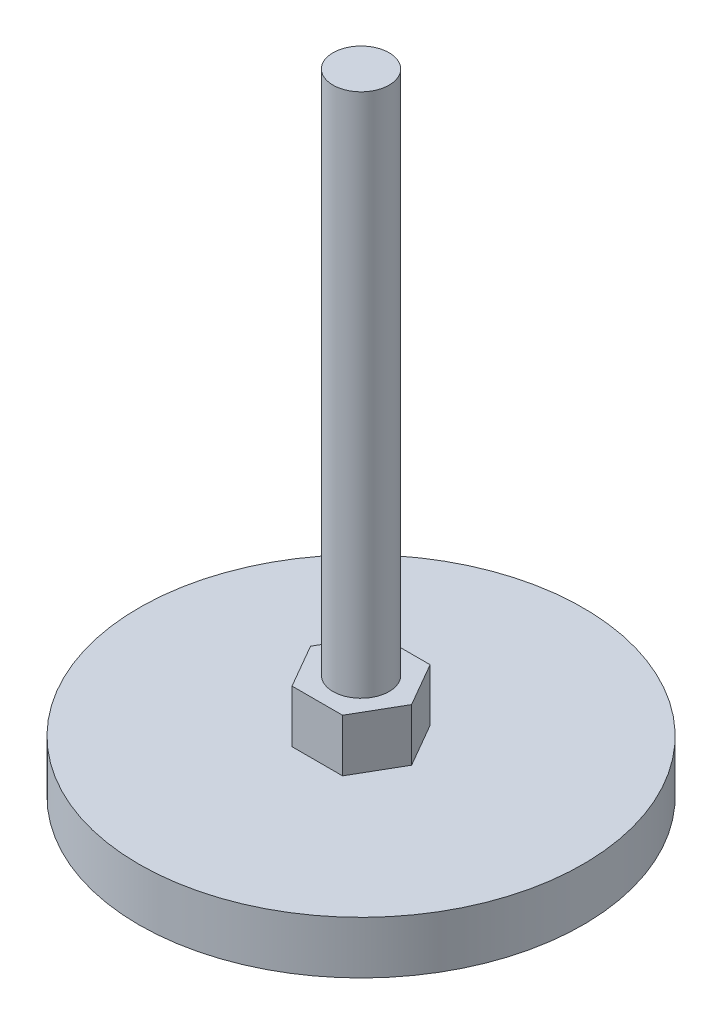
ISO-10303-21;
HEADER;
FILE_DESCRIPTION(('STEP AP214'),'2;1');
FILE_NAME('part.step','',(''),(''),'','','');
FILE_SCHEMA(('AUTOMOTIVE_DESIGN { 1 0 10303 214 1 1 1 1 }'));
ENDSEC;
DATA;
#1=APPLICATION_CONTEXT('core data for automotive mechanical design processes');
#2=APPLICATION_PROTOCOL_DEFINITION('international standard','automotive_design',2000,#1);
#3=PRODUCT_CONTEXT('',#1,'mechanical');
#4=PRODUCT('Part','Part','',(#3));
#5=PRODUCT_RELATED_PRODUCT_CATEGORY('part','',(#4));
#6=PRODUCT_DEFINITION_FORMATION('','',#4);
#7=PRODUCT_DEFINITION_CONTEXT('part definition',#1,'design');
#8=PRODUCT_DEFINITION('design','',#6,#7);
#9=PRODUCT_DEFINITION_SHAPE('','',#8);
#10=(LENGTH_UNIT() NAMED_UNIT(*) SI_UNIT(.MILLI.,.METRE.));
#11=(NAMED_UNIT(*) PLANE_ANGLE_UNIT() SI_UNIT($,.RADIAN.));
#12=(NAMED_UNIT(*) SI_UNIT($,.STERADIAN.) SOLID_ANGLE_UNIT());
#13=UNCERTAINTY_MEASURE_WITH_UNIT(LENGTH_MEASURE(1.E-05),#10,'distance_accuracy_value','');
#14=(GEOMETRIC_REPRESENTATION_CONTEXT(3) GLOBAL_UNCERTAINTY_ASSIGNED_CONTEXT((#13)) GLOBAL_UNIT_ASSIGNED_CONTEXT((#10,
#11,#12)) REPRESENTATION_CONTEXT('',''));
#15=CARTESIAN_POINT('',(0.,0.,0.));
#16=DIRECTION('',(0.,0.,1.));
#17=DIRECTION('',(1.,0.,0.));
#18=AXIS2_PLACEMENT_3D('',#15,#16,#17);
#19=CARTESIAN_POINT('',(0.,12.,0.));
#20=DIRECTION('',(0.,1.,0.));
#21=DIRECTION('',(0.,0.,1.));
#22=AXIS2_PLACEMENT_3D('',#19,#20,#21);
#23=PLANE('',#22);
#24=CARTESIAN_POINT('',(0.,12.,0.));
#25=DIRECTION('',(0.,1.,0.));
#26=DIRECTION('',(0.,0.,1.));
#27=AXIS2_PLACEMENT_3D('',#24,#25,#26);
#28=CIRCLE('',#27,50.744242673168);
#29=CARTESIAN_POINT('',(0.,12.,50.744242673168));
#30=VERTEX_POINT('',#29);
#31=EDGE_CURVE('E11',#30,#30,#28,.T.);
#32=ORIENTED_EDGE('',*,*,#31,.T.);
#33=EDGE_LOOP('',(#32));
#34=FACE_BOUND('',#33,.T.);
#35=DIRECTION('',(-0.5,0.,-0.866025403784438));
#36=VECTOR('',#35,1.);
#37=CARTESIAN_POINT('',(11.5470053837925,12.,0.));
#38=LINE('',#37,#36);
#39=CARTESIAN_POINT('',(11.5470053837925,12.,0.));
#40=VERTEX_POINT('',#39);
#41=CARTESIAN_POINT('',(5.77350269189625,12.,-10.));
#42=VERTEX_POINT('',#41);
#43=EDGE_CURVE('E120',#40,#42,#38,.T.);
#44=ORIENTED_EDGE('',*,*,#43,.F.);
#45=DIRECTION('',(0.5,0.,-0.866025403784439));
#46=VECTOR('',#45,1.);
#47=CARTESIAN_POINT('',(5.77350269189626,12.,10.));
#48=LINE('',#47,#46);
#49=CARTESIAN_POINT('',(5.77350269189626,12.,10.));
#50=VERTEX_POINT('',#49);
#51=EDGE_CURVE('E117',#50,#40,#48,.T.);
#52=ORIENTED_EDGE('',*,*,#51,.F.);
#53=DIRECTION('',(1.,0.,0.));
#54=VECTOR('',#53,1.);
#55=CARTESIAN_POINT('',(-5.77350269189627,12.,10.));
#56=LINE('',#55,#54);
#57=CARTESIAN_POINT('',(-5.77350269189627,12.,10.));
#58=VERTEX_POINT('',#57);
#59=EDGE_CURVE('E76',#58,#50,#56,.T.);
#60=ORIENTED_EDGE('',*,*,#59,.F.);
#61=DIRECTION('',(0.5,0.,0.866025403784439));
#62=VECTOR('',#61,1.);
#63=CARTESIAN_POINT('',(-11.5470053837925,12.,0.));
#64=LINE('',#63,#62);
#65=CARTESIAN_POINT('',(-11.5470053837925,12.,0.));
#66=VERTEX_POINT('',#65);
#67=EDGE_CURVE('E126',#66,#58,#64,.T.);
#68=ORIENTED_EDGE('',*,*,#67,.F.);
#69=DIRECTION('',(-0.5,0.,0.866025403784439));
#70=VECTOR('',#69,1.);
#71=CARTESIAN_POINT('',(-5.77350269189627,12.,-10.));
#72=LINE('',#71,#70);
#73=CARTESIAN_POINT('',(-5.77350269189627,12.,-10.));
#74=VERTEX_POINT('',#73);
#75=EDGE_CURVE('E106',#74,#66,#72,.T.);
#76=ORIENTED_EDGE('',*,*,#75,.F.);
#77=DIRECTION('',(-1.,0.,0.));
#78=VECTOR('',#77,1.);
#79=CARTESIAN_POINT('',(5.77350269189625,12.,-10.));
#80=LINE('',#79,#78);
#81=EDGE_CURVE('E123',#42,#74,#80,.T.);
#82=ORIENTED_EDGE('',*,*,#81,.F.);
#83=EDGE_LOOP('',(#44,#52,#60,#68,#76,#82));
#84=FACE_BOUND('',#83,.T.);
#85=ADVANCED_FACE('F33',(#34,#84),#23,.T.);
#86=CARTESIAN_POINT('',(0.,12.,0.));
#87=DIRECTION('',(0.,-1.,0.));
#88=DIRECTION('',(0.,0.,-1.));
#89=AXIS2_PLACEMENT_3D('',#86,#87,#88);
#90=CYLINDRICAL_SURFACE('',#89,50.744242673168);
#91=ORIENTED_EDGE('',*,*,#31,.F.);
#92=EDGE_LOOP('',(#91));
#93=FACE_BOUND('',#92,.T.);
#94=CARTESIAN_POINT('',(0.,0.,0.));
#95=DIRECTION('',(0.,1.,0.));
#96=DIRECTION('',(0.,0.,1.));
#97=AXIS2_PLACEMENT_3D('',#94,#95,#96);
#98=CIRCLE('',#97,50.744242673168);
#99=CARTESIAN_POINT('',(0.,0.,50.744242673168));
#100=VERTEX_POINT('',#99);
#101=EDGE_CURVE('E37',#100,#100,#98,.T.);
#102=ORIENTED_EDGE('',*,*,#101,.T.);
#103=EDGE_LOOP('',(#102));
#104=FACE_BOUND('',#103,.T.);
#105=ADVANCED_FACE('F35',(#93,#104),#90,.T.);
#106=CARTESIAN_POINT('',(0.,0.,0.));
#107=DIRECTION('',(0.,1.,0.));
#108=DIRECTION('',(0.,0.,1.));
#109=AXIS2_PLACEMENT_3D('',#106,#107,#108);
#110=PLANE('',#109);
#111=ORIENTED_EDGE('',*,*,#101,.F.);
#112=EDGE_LOOP('',(#111));
#113=FACE_BOUND('',#112,.T.);
#114=ADVANCED_FACE('F142',(#113),#110,.F.);
#115=CARTESIAN_POINT('',(5.77350269189626,24.,10.));
#116=DIRECTION('',(-0.866025403784439,0.,-0.5));
#117=DIRECTION('',(-0.5,0.,0.866025403784439));
#118=AXIS2_PLACEMENT_3D('',#115,#116,#117);
#119=PLANE('',#118);
#120=ORIENTED_EDGE('',*,*,#51,.T.);
#121=DIRECTION('',(0.,-1.,0.));
#122=VECTOR('',#121,1.);
#123=CARTESIAN_POINT('',(11.5470053837925,24.,0.));
#124=LINE('',#123,#122);
#125=CARTESIAN_POINT('',(11.5470053837925,24.,0.));
#126=VERTEX_POINT('',#125);
#127=EDGE_CURVE('E136',#126,#40,#124,.T.);
#128=ORIENTED_EDGE('',*,*,#127,.F.);
#129=DIRECTION('',(0.5,0.,-0.866025403784439));
#130=VECTOR('',#129,1.);
#131=CARTESIAN_POINT('',(5.77350269189626,24.,10.));
#132=LINE('',#131,#130);
#133=CARTESIAN_POINT('',(5.77350269189626,24.,10.));
#134=VERTEX_POINT('',#133);
#135=EDGE_CURVE('E129',#134,#126,#132,.T.);
#136=ORIENTED_EDGE('',*,*,#135,.F.);
#137=DIRECTION('',(0.,-1.,0.));
#138=VECTOR('',#137,1.);
#139=CARTESIAN_POINT('',(5.77350269189626,24.,10.));
#140=LINE('',#139,#138);
#141=EDGE_CURVE('E113',#134,#50,#140,.T.);
#142=ORIENTED_EDGE('',*,*,#141,.T.);
#143=EDGE_LOOP('',(#120,#128,#136,#142));
#144=FACE_BOUND('',#143,.T.);
#145=ADVANCED_FACE('F144',(#144),#119,.F.);
#146=CARTESIAN_POINT('',(11.5470053837925,24.,0.));
#147=DIRECTION('',(-0.866025403784439,0.,0.5));
#148=DIRECTION('',(0.5,0.,0.866025403784439));
#149=AXIS2_PLACEMENT_3D('',#146,#147,#148);
#150=PLANE('',#149);
#151=ORIENTED_EDGE('',*,*,#43,.T.);
#152=DIRECTION('',(0.,-1.,0.));
#153=VECTOR('',#152,1.);
#154=CARTESIAN_POINT('',(5.77350269189625,24.,-10.));
#155=LINE('',#154,#153);
#156=CARTESIAN_POINT('',(5.77350269189625,24.,-10.));
#157=VERTEX_POINT('',#156);
#158=EDGE_CURVE('E133',#157,#42,#155,.T.);
#159=ORIENTED_EDGE('',*,*,#158,.F.);
#160=DIRECTION('',(-0.5,0.,-0.866025403784438));
#161=VECTOR('',#160,1.);
#162=CARTESIAN_POINT('',(11.5470053837925,24.,0.));
#163=LINE('',#162,#161);
#164=EDGE_CURVE('E84',#126,#157,#163,.T.);
#165=ORIENTED_EDGE('',*,*,#164,.F.);
#166=ORIENTED_EDGE('',*,*,#127,.T.);
#167=EDGE_LOOP('',(#151,#159,#165,#166));
#168=FACE_BOUND('',#167,.T.);
#169=ADVANCED_FACE('F149',(#168),#150,.F.);
#170=CARTESIAN_POINT('',(5.77350269189625,24.,-10.));
#171=DIRECTION('',(0.,0.,1.));
#172=DIRECTION('',(1.,0.,0.));
#173=AXIS2_PLACEMENT_3D('',#170,#171,#172);
#174=PLANE('',#173);
#175=ORIENTED_EDGE('',*,*,#81,.T.);
#176=DIRECTION('',(0.,-1.,0.));
#177=VECTOR('',#176,1.);
#178=CARTESIAN_POINT('',(-5.77350269189627,24.,-10.));
#179=LINE('',#178,#177);
#180=CARTESIAN_POINT('',(-5.77350269189627,24.,-10.));
#181=VERTEX_POINT('',#180);
#182=EDGE_CURVE('E109',#181,#74,#179,.T.);
#183=ORIENTED_EDGE('',*,*,#182,.F.);
#184=DIRECTION('',(-1.,0.,0.));
#185=VECTOR('',#184,1.);
#186=CARTESIAN_POINT('',(5.77350269189625,24.,-10.));
#187=LINE('',#186,#185);
#188=EDGE_CURVE('E97',#157,#181,#187,.T.);
#189=ORIENTED_EDGE('',*,*,#188,.F.);
#190=ORIENTED_EDGE('',*,*,#158,.T.);
#191=EDGE_LOOP('',(#175,#183,#189,#190));
#192=FACE_BOUND('',#191,.T.);
#193=ADVANCED_FACE('F162',(#192),#174,.F.);
#194=CARTESIAN_POINT('',(-5.77350269189627,24.,-10.));
#195=DIRECTION('',(0.866025403784439,0.,0.5));
#196=DIRECTION('',(0.5,0.,-0.866025403784439));
#197=AXIS2_PLACEMENT_3D('',#194,#195,#196);
#198=PLANE('',#197);
#199=ORIENTED_EDGE('',*,*,#75,.T.);
#200=DIRECTION('',(0.,-1.,0.));
#201=VECTOR('',#200,1.);
#202=CARTESIAN_POINT('',(-11.5470053837925,24.,0.));
#203=LINE('',#202,#201);
#204=CARTESIAN_POINT('',(-11.5470053837925,24.,0.));
#205=VERTEX_POINT('',#204);
#206=EDGE_CURVE('E103',#205,#66,#203,.T.);
#207=ORIENTED_EDGE('',*,*,#206,.F.);
#208=DIRECTION('',(-0.5,0.,0.866025403784439));
#209=VECTOR('',#208,1.);
#210=CARTESIAN_POINT('',(-5.77350269189627,24.,-10.));
#211=LINE('',#210,#209);
#212=EDGE_CURVE('E91',#181,#205,#211,.T.);
#213=ORIENTED_EDGE('',*,*,#212,.F.);
#214=ORIENTED_EDGE('',*,*,#182,.T.);
#215=EDGE_LOOP('',(#199,#207,#213,#214));
#216=FACE_BOUND('',#215,.T.);
#217=ADVANCED_FACE('F104',(#216),#198,.F.);
#218=CARTESIAN_POINT('',(-11.5470053837925,24.,0.));
#219=DIRECTION('',(0.866025403784439,0.,-0.5));
#220=DIRECTION('',(-0.5,0.,-0.866025403784439));
#221=AXIS2_PLACEMENT_3D('',#218,#219,#220);
#222=PLANE('',#221);
#223=ORIENTED_EDGE('',*,*,#67,.T.);
#224=DIRECTION('',(0.,-1.,0.));
#225=VECTOR('',#224,1.);
#226=CARTESIAN_POINT('',(-5.77350269189627,24.,10.));
#227=LINE('',#226,#225);
#228=CARTESIAN_POINT('',(-5.77350269189627,24.,10.));
#229=VERTEX_POINT('',#228);
#230=EDGE_CURVE('E48',#229,#58,#227,.T.);
#231=ORIENTED_EDGE('',*,*,#230,.F.);
#232=DIRECTION('',(0.5,0.,0.866025403784439));
#233=VECTOR('',#232,1.);
#234=CARTESIAN_POINT('',(-11.5470053837925,24.,0.));
#235=LINE('',#234,#233);
#236=EDGE_CURVE('E95',#205,#229,#235,.T.);
#237=ORIENTED_EDGE('',*,*,#236,.F.);
#238=ORIENTED_EDGE('',*,*,#206,.T.);
#239=EDGE_LOOP('',(#223,#231,#237,#238));
#240=FACE_BOUND('',#239,.T.);
#241=ADVANCED_FACE('F111',(#240),#222,.F.);
#242=CARTESIAN_POINT('',(-5.77350269189627,24.,10.));
#243=DIRECTION('',(0.,0.,-1.));
#244=DIRECTION('',(-1.,0.,0.));
#245=AXIS2_PLACEMENT_3D('',#242,#243,#244);
#246=PLANE('',#245);
#247=ORIENTED_EDGE('',*,*,#59,.T.);
#248=ORIENTED_EDGE('',*,*,#141,.F.);
#249=DIRECTION('',(1.,0.,0.));
#250=VECTOR('',#249,1.);
#251=CARTESIAN_POINT('',(-5.77350269189627,24.,10.));
#252=LINE('',#251,#250);
#253=EDGE_CURVE('E56',#229,#134,#252,.T.);
#254=ORIENTED_EDGE('',*,*,#253,.F.);
#255=ORIENTED_EDGE('',*,*,#230,.T.);
#256=EDGE_LOOP('',(#247,#248,#254,#255));
#257=FACE_BOUND('',#256,.T.);
#258=ADVANCED_FACE('F170',(#257),#246,.F.);
#259=CARTESIAN_POINT('',(0.,24.,0.));
#260=DIRECTION('',(0.,1.,0.));
#261=DIRECTION('',(0.,0.,1.));
#262=AXIS2_PLACEMENT_3D('',#259,#260,#261);
#263=PLANE('',#262);
#264=CARTESIAN_POINT('',(0.,24.,0.));
#265=DIRECTION('',(0.,1.,0.));
#266=DIRECTION('',(0.,0.,1.));
#267=AXIS2_PLACEMENT_3D('',#264,#265,#266);
#268=CIRCLE('',#267,6.41221335164469);
#269=CARTESIAN_POINT('',(0.,24.,6.41221335164469));
#270=VERTEX_POINT('',#269);
#271=EDGE_CURVE('E187',#270,#270,#268,.T.);
#272=ORIENTED_EDGE('',*,*,#271,.F.);
#273=EDGE_LOOP('',(#272));
#274=FACE_BOUND('',#273,.T.);
#275=ORIENTED_EDGE('',*,*,#135,.T.);
#276=ORIENTED_EDGE('',*,*,#164,.T.);
#277=ORIENTED_EDGE('',*,*,#188,.T.);
#278=ORIENTED_EDGE('',*,*,#212,.T.);
#279=ORIENTED_EDGE('',*,*,#236,.T.);
#280=ORIENTED_EDGE('',*,*,#253,.T.);
#281=EDGE_LOOP('',(#275,#276,#277,#278,#279,#280));
#282=FACE_BOUND('',#281,.T.);
#283=ADVANCED_FACE('F93',(#274,#282),#263,.T.);
#284=CARTESIAN_POINT('',(0.,144.,0.));
#285=DIRECTION('',(0.,-1.,0.));
#286=DIRECTION('',(0.,0.,-1.));
#287=AXIS2_PLACEMENT_3D('',#284,#285,#286);
#288=CYLINDRICAL_SURFACE('',#287,6.41221335164469);
#289=CARTESIAN_POINT('',(0.,144.,0.));
#290=DIRECTION('',(0.,1.,0.));
#291=DIRECTION('',(0.,0.,1.));
#292=AXIS2_PLACEMENT_3D('',#289,#290,#291);
#293=CIRCLE('',#292,6.41221335164469);
#294=CARTESIAN_POINT('',(0.,144.,6.41221335164469));
#295=VERTEX_POINT('',#294);
#296=EDGE_CURVE('E121',#295,#295,#293,.T.);
#297=ORIENTED_EDGE('',*,*,#296,.F.);
#298=EDGE_LOOP('',(#297));
#299=FACE_BOUND('',#298,.T.);
#300=ORIENTED_EDGE('',*,*,#271,.T.);
#301=EDGE_LOOP('',(#300));
#302=FACE_BOUND('',#301,.T.);
#303=ADVANCED_FACE('F175',(#299,#302),#288,.T.);
#304=CARTESIAN_POINT('',(0.,144.,0.));
#305=DIRECTION('',(0.,1.,0.));
#306=DIRECTION('',(0.,0.,1.));
#307=AXIS2_PLACEMENT_3D('',#304,#305,#306);
#308=PLANE('',#307);
#309=ORIENTED_EDGE('',*,*,#296,.T.);
#310=EDGE_LOOP('',(#309));
#311=FACE_BOUND('',#310,.T.);
#312=ADVANCED_FACE('F179',(#311),#308,.T.);
#313=CLOSED_SHELL('',(#85,#105,#114,#145,#169,#193,#217,#241,#258,#283,#303,#312));
#314=MANIFOLD_SOLID_BREP('B2',#313);
#315=ADVANCED_BREP_SHAPE_REPRESENTATION('',(#18,#314),#14);
#316=SHAPE_DEFINITION_REPRESENTATION(#9,#315);
ENDSEC;
END-ISO-10303-21;
